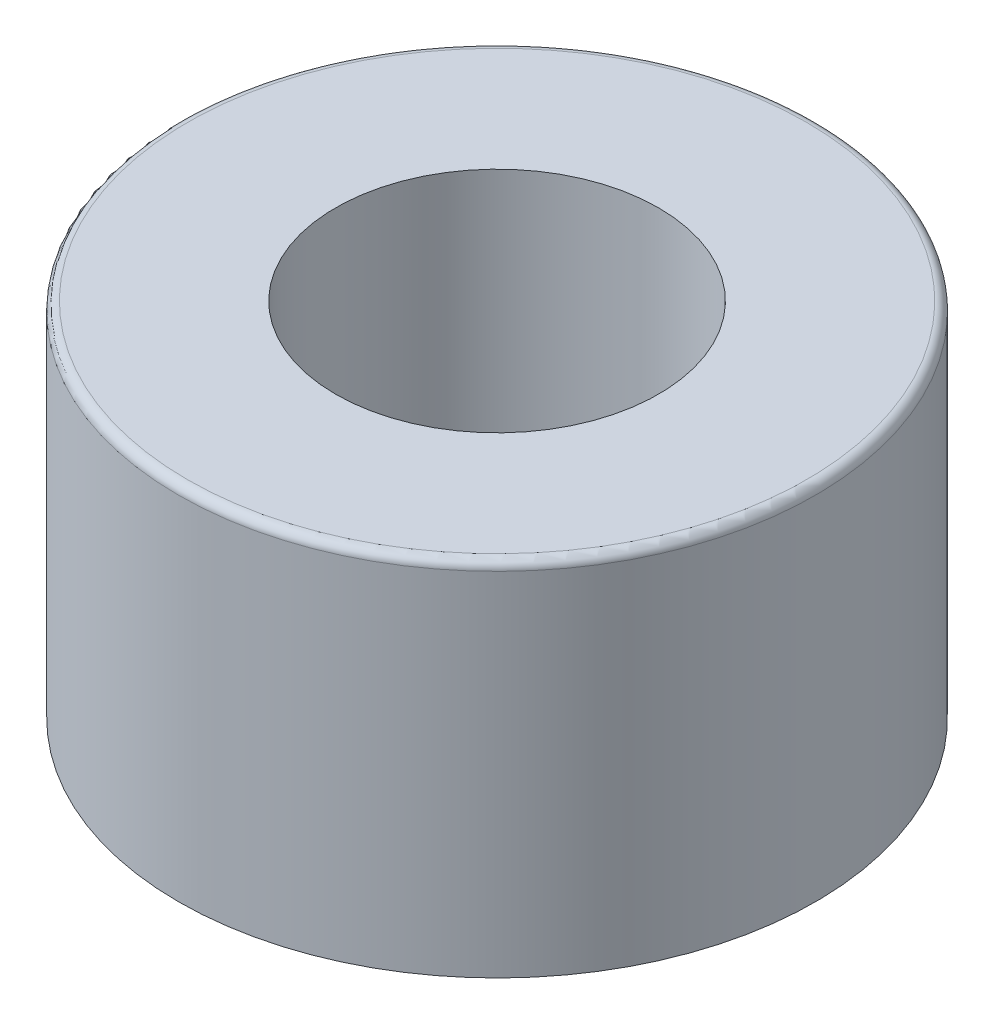
ISO-10303-21;
HEADER;
FILE_DESCRIPTION(('STEP AP214'),'2;1');
FILE_NAME('part.step','',(''),(''),'','','');
FILE_SCHEMA(('AUTOMOTIVE_DESIGN { 1 0 10303 214 1 1 1 1 }'));
ENDSEC;
DATA;
#1=APPLICATION_CONTEXT('core data for automotive mechanical design processes');
#2=APPLICATION_PROTOCOL_DEFINITION('international standard','automotive_design',2000,#1);
#3=PRODUCT_CONTEXT('',#1,'mechanical');
#4=PRODUCT('Part','Part','',(#3));
#5=PRODUCT_RELATED_PRODUCT_CATEGORY('part','',(#4));
#6=PRODUCT_DEFINITION_FORMATION('','',#4);
#7=PRODUCT_DEFINITION_CONTEXT('part definition',#1,'design');
#8=PRODUCT_DEFINITION('design','',#6,#7);
#9=PRODUCT_DEFINITION_SHAPE('','',#8);
#10=(LENGTH_UNIT() NAMED_UNIT(*) SI_UNIT(.MILLI.,.METRE.));
#11=(NAMED_UNIT(*) PLANE_ANGLE_UNIT() SI_UNIT($,.RADIAN.));
#12=(NAMED_UNIT(*) SI_UNIT($,.STERADIAN.) SOLID_ANGLE_UNIT());
#13=UNCERTAINTY_MEASURE_WITH_UNIT(LENGTH_MEASURE(1.E-05),#10,'distance_accuracy_value','');
#14=(GEOMETRIC_REPRESENTATION_CONTEXT(3) GLOBAL_UNCERTAINTY_ASSIGNED_CONTEXT((#13)) GLOBAL_UNIT_ASSIGNED_CONTEXT((#10,
#11,#12)) REPRESENTATION_CONTEXT('',''));
#15=CARTESIAN_POINT('',(0.,0.,0.));
#16=DIRECTION('',(0.,0.,1.));
#17=DIRECTION('',(1.,0.,0.));
#18=AXIS2_PLACEMENT_3D('',#15,#16,#17);
#19=CARTESIAN_POINT('',(0.,10.2235,0.));
#20=DIRECTION('',(0.,1.,0.));
#21=DIRECTION('',(0.,0.,1.));
#22=AXIS2_PLACEMENT_3D('',#19,#20,#21);
#23=PLANE('',#22);
#24=CARTESIAN_POINT('',(0.,10.2235,0.));
#25=DIRECTION('',(0.,1.,0.));
#26=DIRECTION('',(0.,0.,1.));
#27=AXIS2_PLACEMENT_3D('',#24,#25,#26);
#28=CIRCLE('',#27,8.763);
#29=CARTESIAN_POINT('',(0.,10.2235,8.763));
#30=VERTEX_POINT('',#29);
#31=EDGE_CURVE('E49',#30,#30,#28,.T.);
#32=ORIENTED_EDGE('',*,*,#31,.T.);
#33=EDGE_LOOP('',(#32));
#34=FACE_BOUND('',#33,.T.);
#35=CARTESIAN_POINT('',(0.,10.2235,0.));
#36=DIRECTION('',(0.,1.,0.));
#37=DIRECTION('',(0.,0.,1.));
#38=AXIS2_PLACEMENT_3D('',#35,#36,#37);
#39=CIRCLE('',#38,4.572);
#40=CARTESIAN_POINT('',(0.,10.2235,4.572));
#41=VERTEX_POINT('',#40);
#42=EDGE_CURVE('E59',#41,#41,#39,.T.);
#43=ORIENTED_EDGE('',*,*,#42,.F.);
#44=EDGE_LOOP('',(#43));
#45=FACE_BOUND('',#44,.T.);
#46=ADVANCED_FACE('F41',(#34,#45),#23,.T.);
#47=CARTESIAN_POINT('',(0.,0.,0.));
#48=DIRECTION('',(0.,1.,0.));
#49=DIRECTION('',(0.,0.,1.));
#50=AXIS2_PLACEMENT_3D('',#47,#48,#49);
#51=PLANE('',#50);
#52=CARTESIAN_POINT('',(0.,0.,0.));
#53=DIRECTION('',(0.,1.,0.));
#54=DIRECTION('',(0.,0.,1.));
#55=AXIS2_PLACEMENT_3D('',#52,#53,#54);
#56=CIRCLE('',#55,9.017);
#57=CARTESIAN_POINT('',(0.,0.,9.017));
#58=VERTEX_POINT('',#57);
#59=EDGE_CURVE('E54',#58,#58,#56,.T.);
#60=ORIENTED_EDGE('',*,*,#59,.F.);
#61=EDGE_LOOP('',(#60));
#62=FACE_BOUND('',#61,.T.);
#63=CARTESIAN_POINT('',(0.,0.,0.));
#64=DIRECTION('',(0.,1.,0.));
#65=DIRECTION('',(0.,0.,1.));
#66=AXIS2_PLACEMENT_3D('',#63,#64,#65);
#67=CIRCLE('',#66,4.572);
#68=CARTESIAN_POINT('',(0.,0.,4.572));
#69=VERTEX_POINT('',#68);
#70=EDGE_CURVE('E62',#69,#69,#67,.T.);
#71=ORIENTED_EDGE('',*,*,#70,.T.);
#72=EDGE_LOOP('',(#71));
#73=FACE_BOUND('',#72,.T.);
#74=ADVANCED_FACE('F74',(#62,#73),#51,.F.);
#75=CARTESIAN_POINT('',(0.,10.2235,0.));
#76=DIRECTION('',(0.,-1.,0.));
#77=DIRECTION('',(0.,0.,-1.));
#78=AXIS2_PLACEMENT_3D('',#75,#76,#77);
#79=CYLINDRICAL_SURFACE('',#78,9.017);
#80=CARTESIAN_POINT('',(0.,9.9695,0.));
#81=DIRECTION('',(0.,1.,0.));
#82=DIRECTION('',(0.,0.,1.));
#83=AXIS2_PLACEMENT_3D('',#80,#81,#82);
#84=CIRCLE('',#83,9.017);
#85=CARTESIAN_POINT('',(0.,9.9695,9.017));
#86=VERTEX_POINT('',#85);
#87=EDGE_CURVE('E10',#86,#86,#84,.F.);
#88=ORIENTED_EDGE('',*,*,#87,.T.);
#89=EDGE_LOOP('',(#88));
#90=FACE_BOUND('',#89,.T.);
#91=ORIENTED_EDGE('',*,*,#59,.T.);
#92=EDGE_LOOP('',(#91));
#93=FACE_BOUND('',#92,.T.);
#94=ADVANCED_FACE('F79',(#90,#93),#79,.T.);
#95=CARTESIAN_POINT('',(0.,10.2235,0.));
#96=DIRECTION('',(0.,-1.,0.));
#97=DIRECTION('',(0.,0.,-1.));
#98=AXIS2_PLACEMENT_3D('',#95,#96,#97);
#99=CYLINDRICAL_SURFACE('',#98,4.572);
#100=ORIENTED_EDGE('',*,*,#42,.T.);
#101=EDGE_LOOP('',(#100));
#102=FACE_BOUND('',#101,.T.);
#103=ORIENTED_EDGE('',*,*,#70,.F.);
#104=EDGE_LOOP('',(#103));
#105=FACE_BOUND('',#104,.T.);
#106=ADVANCED_FACE('F70',(#102,#105),#99,.F.);
#107=CARTESIAN_POINT('',(0.,9.9695,0.));
#108=DIRECTION('',(0.,1.,0.));
#109=DIRECTION('',(0.,0.,1.));
#110=AXIS2_PLACEMENT_3D('',#107,#108,#109);
#111=TOROIDAL_SURFACE('',#110,8.763,0.254);
#112=ORIENTED_EDGE('',*,*,#87,.F.);
#113=EDGE_LOOP('',(#112));
#114=FACE_BOUND('',#113,.T.);
#115=ORIENTED_EDGE('',*,*,#31,.F.);
#116=EDGE_LOOP('',(#115));
#117=FACE_BOUND('',#116,.T.);
#118=ADVANCED_FACE('F43',(#114,#117),#111,.T.);
#119=CLOSED_SHELL('',(#46,#74,#94,#106,#118));
#120=MANIFOLD_SOLID_BREP('B2',#119);
#121=ADVANCED_BREP_SHAPE_REPRESENTATION('',(#18,#120),#14);
#122=SHAPE_DEFINITION_REPRESENTATION(#9,#121);
ENDSEC;
END-ISO-10303-21;
